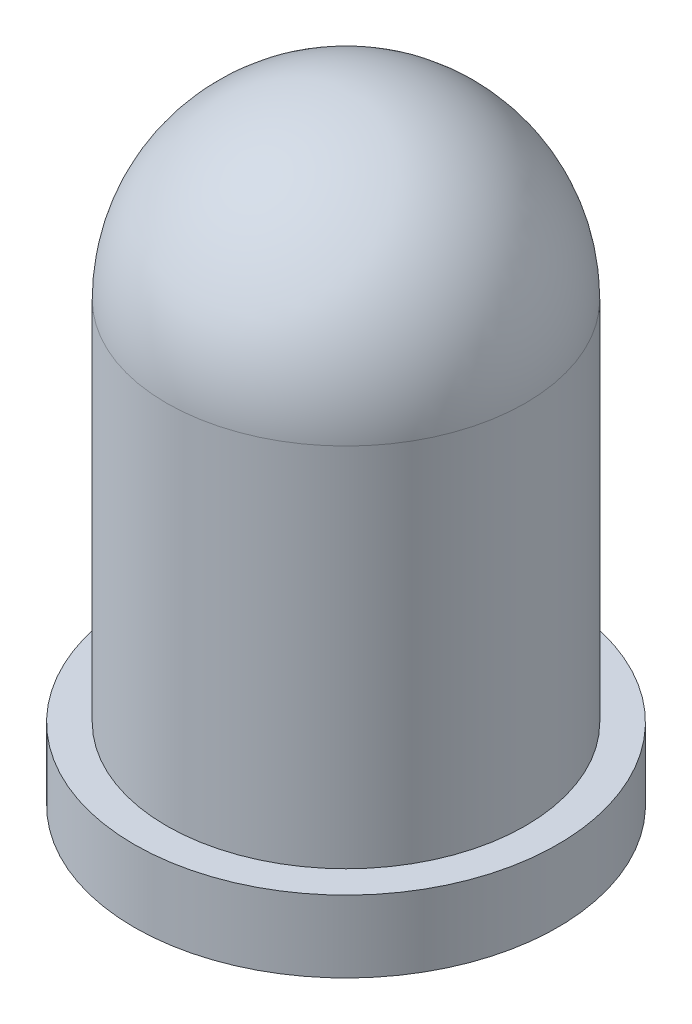
ISO-10303-21;
HEADER;
FILE_DESCRIPTION(('STEP AP214'),'2;1');
FILE_NAME('part.step','',(''),(''),'','','');
FILE_SCHEMA(('AUTOMOTIVE_DESIGN { 1 0 10303 214 1 1 1 1 }'));
ENDSEC;
DATA;
#1=APPLICATION_CONTEXT('core data for automotive mechanical design processes');
#2=APPLICATION_PROTOCOL_DEFINITION('international standard','automotive_design',2000,#1);
#3=PRODUCT_CONTEXT('',#1,'mechanical');
#4=PRODUCT('Part','Part','',(#3));
#5=PRODUCT_RELATED_PRODUCT_CATEGORY('part','',(#4));
#6=PRODUCT_DEFINITION_FORMATION('','',#4);
#7=PRODUCT_DEFINITION_CONTEXT('part definition',#1,'design');
#8=PRODUCT_DEFINITION('design','',#6,#7);
#9=PRODUCT_DEFINITION_SHAPE('','',#8);
#10=(LENGTH_UNIT() NAMED_UNIT(*) SI_UNIT(.MILLI.,.METRE.));
#11=(NAMED_UNIT(*) PLANE_ANGLE_UNIT() SI_UNIT($,.RADIAN.));
#12=(NAMED_UNIT(*) SI_UNIT($,.STERADIAN.) SOLID_ANGLE_UNIT());
#13=UNCERTAINTY_MEASURE_WITH_UNIT(LENGTH_MEASURE(1.E-05),#10,'distance_accuracy_value','');
#14=(GEOMETRIC_REPRESENTATION_CONTEXT(3) GLOBAL_UNCERTAINTY_ASSIGNED_CONTEXT((#13)) GLOBAL_UNIT_ASSIGNED_CONTEXT((#10,
#11,#12)) REPRESENTATION_CONTEXT('',''));
#15=CARTESIAN_POINT('',(0.,0.,0.));
#16=DIRECTION('',(0.,0.,1.));
#17=DIRECTION('',(1.,0.,0.));
#18=AXIS2_PLACEMENT_3D('',#15,#16,#17);
#19=CARTESIAN_POINT('',(0.,1.,0.));
#20=DIRECTION('',(0.,1.,0.));
#21=DIRECTION('',(0.,0.,1.));
#22=AXIS2_PLACEMENT_3D('',#19,#20,#21);
#23=PLANE('',#22);
#24=CARTESIAN_POINT('',(0.,1.,0.));
#25=DIRECTION('',(0.,1.,0.));
#26=DIRECTION('',(0.,0.,1.));
#27=AXIS2_PLACEMENT_3D('',#24,#25,#26);
#28=CIRCLE('',#27,2.95);
#29=CARTESIAN_POINT('',(0.,1.,2.95));
#30=VERTEX_POINT('',#29);
#31=EDGE_CURVE('E38',#30,#30,#28,.T.);
#32=ORIENTED_EDGE('',*,*,#31,.T.);
#33=EDGE_LOOP('',(#32));
#34=FACE_BOUND('',#33,.T.);
#35=CARTESIAN_POINT('',(0.,1.,0.));
#36=DIRECTION('',(0.,1.,0.));
#37=DIRECTION('',(0.,0.,1.));
#38=AXIS2_PLACEMENT_3D('',#35,#36,#37);
#39=CIRCLE('',#38,2.5);
#40=CARTESIAN_POINT('',(0.,1.,-2.5));
#41=VERTEX_POINT('',#40);
#42=EDGE_CURVE('E47',#41,#41,#39,.T.);
#43=ORIENTED_EDGE('',*,*,#42,.F.);
#44=EDGE_LOOP('',(#43));
#45=FACE_BOUND('',#44,.T.);
#46=ADVANCED_FACE('F31',(#34,#45),#23,.T.);
#47=CARTESIAN_POINT('',(0.,1.,0.));
#48=DIRECTION('',(0.,-1.,0.));
#49=DIRECTION('',(0.,0.,-1.));
#50=AXIS2_PLACEMENT_3D('',#47,#48,#49);
#51=CYLINDRICAL_SURFACE('',#50,2.95);
#52=ORIENTED_EDGE('',*,*,#31,.F.);
#53=EDGE_LOOP('',(#52));
#54=FACE_BOUND('',#53,.T.);
#55=CARTESIAN_POINT('',(0.,0.,0.));
#56=DIRECTION('',(0.,1.,0.));
#57=DIRECTION('',(0.,0.,1.));
#58=AXIS2_PLACEMENT_3D('',#55,#56,#57);
#59=CIRCLE('',#58,2.95);
#60=CARTESIAN_POINT('',(0.,0.,2.95));
#61=VERTEX_POINT('',#60);
#62=EDGE_CURVE('E42',#61,#61,#59,.T.);
#63=ORIENTED_EDGE('',*,*,#62,.T.);
#64=EDGE_LOOP('',(#63));
#65=FACE_BOUND('',#64,.T.);
#66=ADVANCED_FACE('F55',(#54,#65),#51,.T.);
#67=CARTESIAN_POINT('',(0.,0.,0.));
#68=DIRECTION('',(0.,1.,0.));
#69=DIRECTION('',(0.,0.,1.));
#70=AXIS2_PLACEMENT_3D('',#67,#68,#69);
#71=PLANE('',#70);
#72=ORIENTED_EDGE('',*,*,#62,.F.);
#73=EDGE_LOOP('',(#72));
#74=FACE_BOUND('',#73,.T.);
#75=ADVANCED_FACE('F60',(#74),#71,.F.);
#76=CARTESIAN_POINT('',(0.,8.6,0.));
#77=DIRECTION('',(0.,-1.,0.));
#78=DIRECTION('',(0.,0.,-1.));
#79=AXIS2_PLACEMENT_3D('',#76,#77,#78);
#80=CYLINDRICAL_SURFACE('',#79,2.5);
#81=CARTESIAN_POINT('',(0.,6.1,0.));
#82=DIRECTION('',(0.,-1.,0.));
#83=DIRECTION('',(0.,0.,-1.));
#84=AXIS2_PLACEMENT_3D('',#81,#82,#83);
#85=CIRCLE('',#84,2.5);
#86=CARTESIAN_POINT('',(0.,6.1,-2.5));
#87=VERTEX_POINT('',#86);
#88=EDGE_CURVE('E10',#87,#87,#85,.T.);
#89=CARTESIAN_POINT('',(0.,6.1,-2.5));
#90=CARTESIAN_POINT('',(0.,6.046875,-2.5));
#91=CARTESIAN_POINT('',(0.,5.99375,-2.5));
#92=CARTESIAN_POINT('',(0.,5.8875,-2.5));
#93=CARTESIAN_POINT('',(0.,5.834375,-2.5));
#94=CARTESIAN_POINT('',(0.,5.728125,-2.5));
#95=CARTESIAN_POINT('',(0.,5.675,-2.5));
#96=CARTESIAN_POINT('',(0.,5.56875,-2.5));
#97=CARTESIAN_POINT('',(0.,5.515625,-2.5));
#98=CARTESIAN_POINT('',(0.,5.409375,-2.5));
#99=CARTESIAN_POINT('',(0.,5.35625,-2.5));
#100=CARTESIAN_POINT('',(0.,5.25,-2.5));
#101=CARTESIAN_POINT('',(0.,5.196875,-2.5));
#102=CARTESIAN_POINT('',(0.,5.090625,-2.5));
#103=CARTESIAN_POINT('',(0.,5.0375,-2.5));
#104=CARTESIAN_POINT('',(0.,4.93125,-2.5));
#105=CARTESIAN_POINT('',(0.,4.878125,-2.5));
#106=CARTESIAN_POINT('',(0.,4.771875,-2.5));
#107=CARTESIAN_POINT('',(0.,4.71875,-2.5));
#108=CARTESIAN_POINT('',(0.,4.6125,-2.5));
#109=CARTESIAN_POINT('',(0.,4.559375,-2.5));
#110=CARTESIAN_POINT('',(0.,4.453125,-2.5));
#111=CARTESIAN_POINT('',(0.,4.4,-2.5));
#112=CARTESIAN_POINT('',(0.,4.29375,-2.5));
#113=CARTESIAN_POINT('',(0.,4.240625,-2.5));
#114=CARTESIAN_POINT('',(0.,4.134375,-2.5));
#115=CARTESIAN_POINT('',(0.,4.08125,-2.5));
#116=CARTESIAN_POINT('',(0.,3.975,-2.5));
#117=CARTESIAN_POINT('',(0.,3.921875,-2.5));
#118=CARTESIAN_POINT('',(0.,3.815625,-2.5));
#119=CARTESIAN_POINT('',(0.,3.7625,-2.5));
#120=CARTESIAN_POINT('',(0.,3.65625,-2.5));
#121=CARTESIAN_POINT('',(0.,3.603125,-2.5));
#122=CARTESIAN_POINT('',(0.,3.496875,-2.5));
#123=CARTESIAN_POINT('',(0.,3.44375,-2.5));
#124=CARTESIAN_POINT('',(0.,3.3375,-2.5));
#125=CARTESIAN_POINT('',(0.,3.284375,-2.5));
#126=CARTESIAN_POINT('',(0.,3.178125,-2.5));
#127=CARTESIAN_POINT('',(0.,3.125,-2.5));
#128=CARTESIAN_POINT('',(0.,3.01875,-2.5));
#129=CARTESIAN_POINT('',(0.,2.965625,-2.5));
#130=CARTESIAN_POINT('',(0.,2.859375,-2.5));
#131=CARTESIAN_POINT('',(0.,2.80625,-2.5));
#132=CARTESIAN_POINT('',(0.,2.7,-2.5));
#133=CARTESIAN_POINT('',(0.,2.646875,-2.5));
#134=CARTESIAN_POINT('',(0.,2.540625,-2.5));
#135=CARTESIAN_POINT('',(0.,2.4875,-2.5));
#136=CARTESIAN_POINT('',(0.,2.38125,-2.5));
#137=CARTESIAN_POINT('',(0.,2.328125,-2.5));
#138=CARTESIAN_POINT('',(0.,2.221875,-2.5));
#139=CARTESIAN_POINT('',(0.,2.16875,-2.5));
#140=CARTESIAN_POINT('',(0.,2.0625,-2.5));
#141=CARTESIAN_POINT('',(0.,2.009375,-2.5));
#142=CARTESIAN_POINT('',(0.,1.903125,-2.5));
#143=CARTESIAN_POINT('',(0.,1.85,-2.5));
#144=CARTESIAN_POINT('',(0.,1.74375,-2.5));
#145=CARTESIAN_POINT('',(0.,1.690625,-2.5));
#146=CARTESIAN_POINT('',(0.,1.584375,-2.5));
#147=CARTESIAN_POINT('',(0.,1.53125,-2.5));
#148=CARTESIAN_POINT('',(0.,1.425,-2.5));
#149=CARTESIAN_POINT('',(0.,1.371875,-2.5));
#150=CARTESIAN_POINT('',(0.,1.265625,-2.5));
#151=CARTESIAN_POINT('',(0.,1.2125,-2.5));
#152=CARTESIAN_POINT('',(0.,1.10625,-2.5));
#153=CARTESIAN_POINT('',(0.,1.053125,-2.5));
#154=CARTESIAN_POINT('',(0.,1.,-2.5));
#155=B_SPLINE_CURVE_WITH_KNOTS('',3,(#89,#90,#91,#92,#93,#94,#95,#96,#97,#98,#99,#100,#101,#102,
#103,#104,#105,#106,#107,#108,#109,#110,#111,#112,#113,#114,#115,#116,#117,#118,#119,#120,#121,
#122,#123,#124,#125,#126,#127,#128,#129,#130,#131,#132,#133,#134,#135,#136,#137,#138,#139,#140,
#141,#142,#143,#144,#145,#146,#147,#148,#149,#150,#151,#152,#153,#154),.UNSPECIFIED.,.F.,.F.,(4,
2,2,2,2,2,2,2,2,2,2,2,2,2,2,2,2,2,2,2,2,2,2,2,2,2,2,2,2,2,2,2,4),(0.,0.159375,0.31875,
0.478124999999999,0.637499999999999,0.796874999999999,0.95625,1.115625,1.275,1.434375,1.59375,
1.753125,1.9125,2.071875,2.23125,2.390625,2.55,2.709375,2.86875,3.028125,3.1875,3.346875,
3.50625,3.665625,3.825,3.984375,4.14375,4.303125,4.4625,4.621875,4.78125,4.940625,5.1),.UNSPECIFIED.);
#156=EDGE_CURVE('BSEAM52',#87,#41,#155,.T.);
#157=ORIENTED_EDGE('',*,*,#88,.T.);
#158=ORIENTED_EDGE('',*,*,#42,.T.);
#159=ORIENTED_EDGE('',*,*,#156,.T.);
#160=ORIENTED_EDGE('',*,*,#156,.F.);
#161=EDGE_LOOP('',(#157,#159,#158,#160));
#162=FACE_BOUND('',#161,.T.);
#163=ADVANCED_FACE('F52',(#162),#80,.T.);
#164=CARTESIAN_POINT('',(0.,6.1,0.));
#165=DIRECTION('',(0.,0.,1.));
#166=DIRECTION('',(1.,0.,0.));
#167=AXIS2_PLACEMENT_3D('',#164,#165,#166);
#168=SPHERICAL_SURFACE('',#167,2.5);
#169=CARTESIAN_POINT('',(0.,6.1,0.));
#170=DIRECTION('',(0.,-1.,0.));
#171=DIRECTION('',(0.,0.,-1.));
#172=AXIS2_PLACEMENT_3D('',#169,#170,#171);
#173=SPHERICAL_SURFACE('',#172,2.5);
#174=ORIENTED_EDGE('',*,*,#88,.F.);
#175=EDGE_LOOP('',(#174));
#176=FACE_BOUND('',#175,.T.);
#177=ADVANCED_FACE('F33',(#176),#173,.T.);
#178=CLOSED_SHELL('',(#46,#66,#75,#163,#177));
#179=MANIFOLD_SOLID_BREP('B2',#178);
#180=ADVANCED_BREP_SHAPE_REPRESENTATION('',(#18,#179),#14);
#181=SHAPE_DEFINITION_REPRESENTATION(#9,#180);
ENDSEC;
END-ISO-10303-21;
